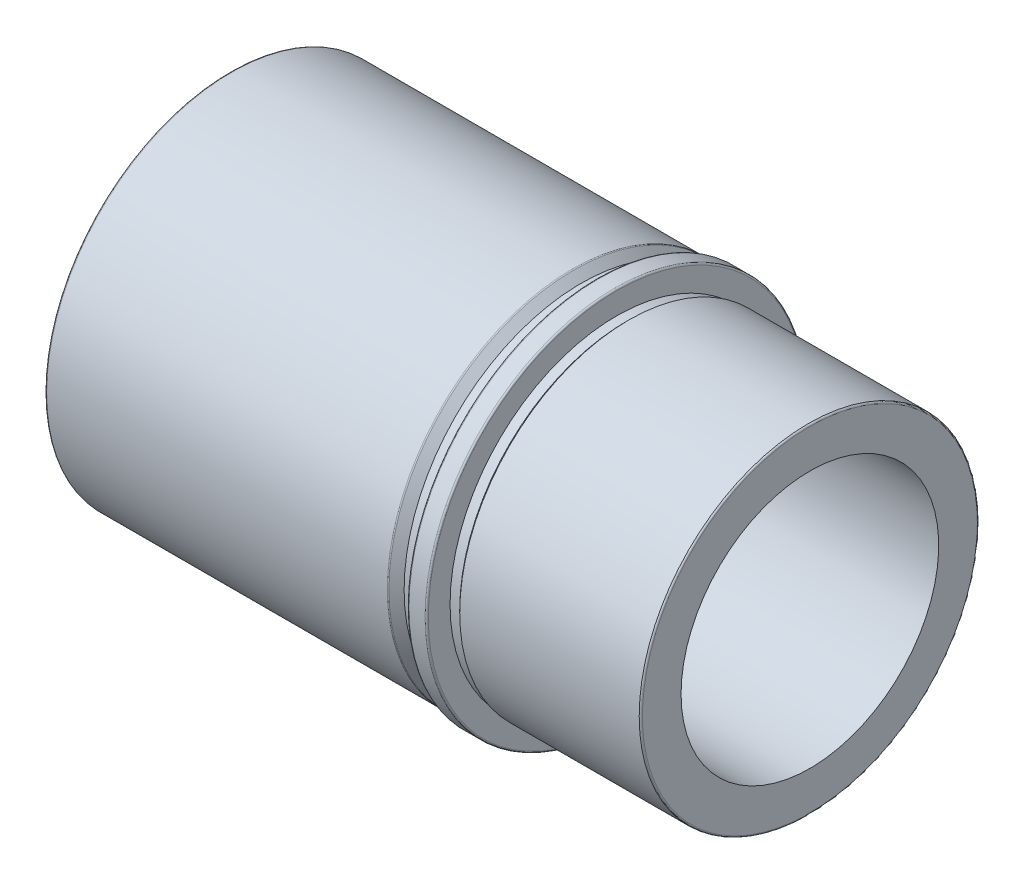
ISO-10303-21;
HEADER;
FILE_DESCRIPTION(('STEP AP214'),'2;1');
FILE_NAME('part.step','',(''),(''),'','','');
FILE_SCHEMA(('AUTOMOTIVE_DESIGN { 1 0 10303 214 1 1 1 1 }'));
ENDSEC;
DATA;
#1=APPLICATION_CONTEXT('core data for automotive mechanical design processes');
#2=APPLICATION_PROTOCOL_DEFINITION('international standard','automotive_design',2000,#1);
#3=PRODUCT_CONTEXT('',#1,'mechanical');
#4=PRODUCT('Part','Part','',(#3));
#5=PRODUCT_RELATED_PRODUCT_CATEGORY('part','',(#4));
#6=PRODUCT_DEFINITION_FORMATION('','',#4);
#7=PRODUCT_DEFINITION_CONTEXT('part definition',#1,'design');
#8=PRODUCT_DEFINITION('design','',#6,#7);
#9=PRODUCT_DEFINITION_SHAPE('','',#8);
#10=(LENGTH_UNIT() NAMED_UNIT(*) SI_UNIT(.MILLI.,.METRE.));
#11=(NAMED_UNIT(*) PLANE_ANGLE_UNIT() SI_UNIT($,.RADIAN.));
#12=(NAMED_UNIT(*) SI_UNIT($,.STERADIAN.) SOLID_ANGLE_UNIT());
#13=UNCERTAINTY_MEASURE_WITH_UNIT(LENGTH_MEASURE(1.E-05),#10,'distance_accuracy_value','');
#14=(GEOMETRIC_REPRESENTATION_CONTEXT(3) GLOBAL_UNCERTAINTY_ASSIGNED_CONTEXT((#13)) GLOBAL_UNIT_ASSIGNED_CONTEXT((#10,
#11,#12)) REPRESENTATION_CONTEXT('',''));
#15=CARTESIAN_POINT('',(0.,0.,0.));
#16=DIRECTION('',(0.,0.,1.));
#17=DIRECTION('',(1.,0.,0.));
#18=AXIS2_PLACEMENT_3D('',#15,#16,#17);
#19=CARTESIAN_POINT('',(-114.,-40.,0.));
#20=DIRECTION('',(-1.,0.,0.));
#21=DIRECTION('',(0.,0.,1.));
#22=AXIS2_PLACEMENT_3D('',#19,#20,#21);
#23=PLANE('',#22);
#24=CARTESIAN_POINT('',(-114.,0.,0.));
#25=DIRECTION('',(-1.,0.,0.));
#26=DIRECTION('',(0.,0.,1.));
#27=AXIS2_PLACEMENT_3D('',#24,#25,#26);
#28=CIRCLE('',#27,40.5);
#29=CARTESIAN_POINT('',(-114.,0.,40.5));
#30=VERTEX_POINT('',#29);
#31=EDGE_CURVE('E10',#30,#30,#28,.F.);
#32=ORIENTED_EDGE('',*,*,#31,.T.);
#33=EDGE_LOOP('',(#32));
#34=FACE_BOUND('',#33,.T.);
#35=CARTESIAN_POINT('',(-114.,0.,0.));
#36=DIRECTION('',(-1.,0.,0.));
#37=DIRECTION('',(0.,0.,1.));
#38=AXIS2_PLACEMENT_3D('',#35,#36,#37);
#39=CIRCLE('',#38,57.);
#40=CARTESIAN_POINT('',(-114.,0.,57.));
#41=VERTEX_POINT('',#40);
#42=EDGE_CURVE('E37',#41,#41,#39,.T.);
#43=ORIENTED_EDGE('',*,*,#42,.T.);
#44=EDGE_LOOP('',(#43));
#45=FACE_BOUND('',#44,.T.);
#46=ADVANCED_FACE('F30',(#34,#45),#23,.T.);
#47=CARTESIAN_POINT('',(-138.75822941746,0.,0.));
#48=DIRECTION('',(-1.,0.,0.));
#49=DIRECTION('',(0.,0.,1.));
#50=AXIS2_PLACEMENT_3D('',#47,#48,#49);
#51=CYLINDRICAL_SURFACE('',#50,57.5);
#52=CARTESIAN_POINT('',(-7.70710678118655,0.,0.));
#53=DIRECTION('',(1.,0.,0.));
#54=DIRECTION('',(0.,0.,-1.));
#55=AXIS2_PLACEMENT_3D('',#52,#53,#54);
#56=CIRCLE('',#55,57.5);
#57=CARTESIAN_POINT('',(-7.70710678118655,0.,-57.5));
#58=VERTEX_POINT('',#57);
#59=EDGE_CURVE('E50',#58,#58,#56,.F.);
#60=ORIENTED_EDGE('',*,*,#59,.T.);
#61=EDGE_LOOP('',(#60));
#62=FACE_BOUND('',#61,.T.);
#63=CARTESIAN_POINT('',(-113.5,0.,0.));
#64=DIRECTION('',(-1.,0.,0.));
#65=DIRECTION('',(0.,0.,1.));
#66=AXIS2_PLACEMENT_3D('',#63,#64,#65);
#67=CIRCLE('',#66,57.5);
#68=CARTESIAN_POINT('',(-113.5,0.,57.5));
#69=VERTEX_POINT('',#68);
#70=EDGE_CURVE('E53',#69,#69,#67,.F.);
#71=ORIENTED_EDGE('',*,*,#70,.T.);
#72=EDGE_LOOP('',(#71));
#73=FACE_BOUND('',#72,.T.);
#74=ADVANCED_FACE('F111',(#62,#73),#51,.T.);
#75=CARTESIAN_POINT('',(-7.50000000000001,0.,0.));
#76=DIRECTION('',(-1.,0.,0.));
#77=DIRECTION('',(0.,0.,1.));
#78=AXIS2_PLACEMENT_3D('',#75,#76,#77);
#79=CONICAL_SURFACE('',#78,57.5,0.78539816339745);
#80=CARTESIAN_POINT('',(-7.35355339059329,0.,0.));
#81=DIRECTION('',(1.,0.,0.));
#82=DIRECTION('',(0.,0.,-1.));
#83=AXIS2_PLACEMENT_3D('',#80,#81,#82);
#84=CIRCLE('',#83,57.3535533905933);
#85=CARTESIAN_POINT('',(-7.35355339059329,0.,-57.3535533905933));
#86=VERTEX_POINT('',#85);
#87=EDGE_CURVE('E45',#86,#86,#84,.T.);
#88=ORIENTED_EDGE('',*,*,#87,.T.);
#89=EDGE_LOOP('',(#88));
#90=FACE_BOUND('',#89,.T.);
#91=CARTESIAN_POINT('',(-5.,0.,0.));
#92=DIRECTION('',(-1.,0.,0.));
#93=DIRECTION('',(0.,0.,1.));
#94=AXIS2_PLACEMENT_3D('',#91,#92,#93);
#95=CIRCLE('',#94,55.);
#96=CARTESIAN_POINT('',(-5.,0.,55.));
#97=VERTEX_POINT('',#96);
#98=EDGE_CURVE('E74',#97,#97,#95,.T.);
#99=ORIENTED_EDGE('',*,*,#98,.T.);
#100=EDGE_LOOP('',(#99));
#101=FACE_BOUND('',#100,.T.);
#102=ADVANCED_FACE('F116',(#90,#101),#79,.T.);
#103=CARTESIAN_POINT('',(-138.75822941746,0.,0.));
#104=DIRECTION('',(-1.,0.,0.));
#105=DIRECTION('',(0.,0.,1.));
#106=AXIS2_PLACEMENT_3D('',#103,#104,#105);
#107=CYLINDRICAL_SURFACE('',#106,55.);
#108=CARTESIAN_POINT('',(0.,0.,0.));
#109=DIRECTION('',(-1.,0.,0.));
#110=DIRECTION('',(0.,0.,1.));
#111=AXIS2_PLACEMENT_3D('',#108,#109,#110);
#112=CIRCLE('',#111,55.);
#113=CARTESIAN_POINT('',(0.,0.,55.));
#114=VERTEX_POINT('',#113);
#115=EDGE_CURVE('E77',#114,#114,#112,.T.);
#116=ORIENTED_EDGE('',*,*,#115,.T.);
#117=EDGE_LOOP('',(#116));
#118=FACE_BOUND('',#117,.T.);
#119=ORIENTED_EDGE('',*,*,#98,.F.);
#120=EDGE_LOOP('',(#119));
#121=FACE_BOUND('',#120,.T.);
#122=ADVANCED_FACE('F228',(#118,#121),#107,.T.);
#123=CARTESIAN_POINT('',(0.,-55.,0.));
#124=DIRECTION('',(-1.,0.,0.));
#125=DIRECTION('',(0.,0.,1.));
#126=AXIS2_PLACEMENT_3D('',#123,#124,#125);
#127=PLANE('',#126);
#128=CARTESIAN_POINT('',(0.,0.,0.));
#129=DIRECTION('',(-1.,0.,0.));
#130=DIRECTION('',(0.,0.,1.));
#131=AXIS2_PLACEMENT_3D('',#128,#129,#130);
#132=CIRCLE('',#131,58.5);
#133=CARTESIAN_POINT('',(0.,0.,58.5));
#134=VERTEX_POINT('',#133);
#135=EDGE_CURVE('E56',#134,#134,#132,.T.);
#136=ORIENTED_EDGE('',*,*,#135,.T.);
#137=EDGE_LOOP('',(#136));
#138=FACE_BOUND('',#137,.T.);
#139=ORIENTED_EDGE('',*,*,#115,.F.);
#140=EDGE_LOOP('',(#139));
#141=FACE_BOUND('',#140,.T.);
#142=ADVANCED_FACE('F218',(#138,#141),#127,.T.);
#143=CARTESIAN_POINT('',(-138.75822941746,0.,0.));
#144=DIRECTION('',(-1.,0.,0.));
#145=DIRECTION('',(0.,0.,1.));
#146=AXIS2_PLACEMENT_3D('',#143,#144,#145);
#147=CYLINDRICAL_SURFACE('',#146,59.);
#148=CARTESIAN_POINT('',(5.50000000000001,0.,0.));
#149=DIRECTION('',(1.,0.,0.));
#150=DIRECTION('',(0.,0.,-1.));
#151=AXIS2_PLACEMENT_3D('',#148,#149,#150);
#152=CIRCLE('',#151,59.);
#153=CARTESIAN_POINT('',(5.50000000000001,0.,-59.));
#154=VERTEX_POINT('',#153);
#155=EDGE_CURVE('E62',#154,#154,#152,.F.);
#156=ORIENTED_EDGE('',*,*,#155,.T.);
#157=EDGE_LOOP('',(#156));
#158=FACE_BOUND('',#157,.T.);
#159=CARTESIAN_POINT('',(0.5,0.,0.));
#160=DIRECTION('',(-1.,0.,0.));
#161=DIRECTION('',(0.,0.,1.));
#162=AXIS2_PLACEMENT_3D('',#159,#160,#161);
#163=CIRCLE('',#162,59.);
#164=CARTESIAN_POINT('',(0.5,0.,59.));
#165=VERTEX_POINT('',#164);
#166=EDGE_CURVE('E65',#165,#165,#163,.F.);
#167=ORIENTED_EDGE('',*,*,#166,.T.);
#168=EDGE_LOOP('',(#167));
#169=FACE_BOUND('',#168,.T.);
#170=ADVANCED_FACE('F206',(#158,#169),#147,.T.);
#171=CARTESIAN_POINT('',(6.,-59.,0.));
#172=DIRECTION('',(1.,0.,0.));
#173=DIRECTION('',(0.,0.,-1.));
#174=AXIS2_PLACEMENT_3D('',#171,#172,#173);
#175=PLANE('',#174);
#176=CARTESIAN_POINT('',(6.,0.,0.));
#177=DIRECTION('',(1.,0.,0.));
#178=DIRECTION('',(0.,0.,-1.));
#179=AXIS2_PLACEMENT_3D('',#176,#177,#178);
#180=CIRCLE('',#179,58.5);
#181=CARTESIAN_POINT('',(6.,0.,-58.5));
#182=VERTEX_POINT('',#181);
#183=EDGE_CURVE('E59',#182,#182,#180,.T.);
#184=ORIENTED_EDGE('',*,*,#183,.T.);
#185=EDGE_LOOP('',(#184));
#186=FACE_BOUND('',#185,.T.);
#187=CARTESIAN_POINT('',(6.00000000000001,0.,0.));
#188=DIRECTION('',(-1.,0.,0.));
#189=DIRECTION('',(0.,0.,1.));
#190=AXIS2_PLACEMENT_3D('',#187,#188,#189);
#191=CIRCLE('',#190,51.7333656624692);
#192=CARTESIAN_POINT('',(6.00000000000001,0.,51.7333656624692));
#193=VERTEX_POINT('',#192);
#194=EDGE_CURVE('E80',#193,#193,#191,.T.);
#195=ORIENTED_EDGE('',*,*,#194,.T.);
#196=EDGE_LOOP('',(#195));
#197=FACE_BOUND('',#196,.T.);
#198=ADVANCED_FACE('F200',(#186,#197),#175,.T.);
#199=CARTESIAN_POINT('',(-138.75822941746,0.,0.));
#200=DIRECTION('',(-1.,0.,0.));
#201=DIRECTION('',(0.,0.,1.));
#202=AXIS2_PLACEMENT_3D('',#199,#200,#201);
#203=CYLINDRICAL_SURFACE('',#202,51.7333656624692);
#204=CARTESIAN_POINT('',(9.00000000000001,0.,0.));
#205=DIRECTION('',(-1.,0.,0.));
#206=DIRECTION('',(0.,0.,1.));
#207=AXIS2_PLACEMENT_3D('',#204,#205,#206);
#208=CIRCLE('',#207,51.7333656624692);
#209=CARTESIAN_POINT('',(9.00000000000001,0.,51.7333656624692));
#210=VERTEX_POINT('',#209);
#211=EDGE_CURVE('E83',#210,#210,#208,.T.);
#212=ORIENTED_EDGE('',*,*,#211,.T.);
#213=EDGE_LOOP('',(#212));
#214=FACE_BOUND('',#213,.T.);
#215=ORIENTED_EDGE('',*,*,#194,.F.);
#216=EDGE_LOOP('',(#215));
#217=FACE_BOUND('',#216,.T.);
#218=ADVANCED_FACE('F205',(#214,#217),#203,.T.);
#219=CARTESIAN_POINT('',(9.00000000000001,0.,0.));
#220=DIRECTION('',(1.,0.,0.));
#221=DIRECTION('',(0.,0.,-1.));
#222=AXIS2_PLACEMENT_3D('',#219,#220,#221);
#223=CONICAL_SURFACE('',#222,51.7333656624692,0.785398163397462);
#224=CARTESIAN_POINT('',(9.76663433753078,0.,0.));
#225=DIRECTION('',(-1.,0.,0.));
#226=DIRECTION('',(0.,0.,1.));
#227=AXIS2_PLACEMENT_3D('',#224,#225,#226);
#228=CIRCLE('',#227,52.5);
#229=CARTESIAN_POINT('',(9.76663433753078,0.,52.5));
#230=VERTEX_POINT('',#229);
#231=EDGE_CURVE('E86',#230,#230,#228,.T.);
#232=ORIENTED_EDGE('',*,*,#231,.T.);
#233=EDGE_LOOP('',(#232));
#234=FACE_BOUND('',#233,.T.);
#235=ORIENTED_EDGE('',*,*,#211,.F.);
#236=EDGE_LOOP('',(#235));
#237=FACE_BOUND('',#236,.T.);
#238=ADVANCED_FACE('F192',(#234,#237),#223,.T.);
#239=CARTESIAN_POINT('',(-138.75822941746,0.,0.));
#240=DIRECTION('',(-1.,0.,0.));
#241=DIRECTION('',(0.,0.,1.));
#242=AXIS2_PLACEMENT_3D('',#239,#240,#241);
#243=CYLINDRICAL_SURFACE('',#242,52.5);
#244=CARTESIAN_POINT('',(65.5,0.,0.));
#245=DIRECTION('',(1.,0.,0.));
#246=DIRECTION('',(0.,0.,-1.));
#247=AXIS2_PLACEMENT_3D('',#244,#245,#246);
#248=CIRCLE('',#247,52.5);
#249=CARTESIAN_POINT('',(65.5,0.,-52.5));
#250=VERTEX_POINT('',#249);
#251=EDGE_CURVE('E71',#250,#250,#248,.F.);
#252=ORIENTED_EDGE('',*,*,#251,.T.);
#253=EDGE_LOOP('',(#252));
#254=FACE_BOUND('',#253,.T.);
#255=ORIENTED_EDGE('',*,*,#231,.F.);
#256=EDGE_LOOP('',(#255));
#257=FACE_BOUND('',#256,.T.);
#258=ADVANCED_FACE('F107',(#254,#257),#243,.T.);
#259=CARTESIAN_POINT('',(66.,-52.5,0.));
#260=DIRECTION('',(1.,0.,0.));
#261=DIRECTION('',(0.,0.,-1.));
#262=AXIS2_PLACEMENT_3D('',#259,#260,#261);
#263=PLANE('',#262);
#264=CARTESIAN_POINT('',(66.,0.,0.));
#265=DIRECTION('',(1.,0.,0.));
#266=DIRECTION('',(0.,0.,-1.));
#267=AXIS2_PLACEMENT_3D('',#264,#265,#266);
#268=CIRCLE('',#267,52.);
#269=CARTESIAN_POINT('',(66.,0.,-52.));
#270=VERTEX_POINT('',#269);
#271=EDGE_CURVE('E68',#270,#270,#268,.T.);
#272=ORIENTED_EDGE('',*,*,#271,.T.);
#273=EDGE_LOOP('',(#272));
#274=FACE_BOUND('',#273,.T.);
#275=CARTESIAN_POINT('',(66.,0.,0.));
#276=DIRECTION('',(-1.,0.,0.));
#277=DIRECTION('',(0.,0.,1.));
#278=AXIS2_PLACEMENT_3D('',#275,#276,#277);
#279=CIRCLE('',#278,40.);
#280=CARTESIAN_POINT('',(66.,0.,40.));
#281=VERTEX_POINT('',#280);
#282=EDGE_CURVE('E89',#281,#281,#279,.T.);
#283=ORIENTED_EDGE('',*,*,#282,.T.);
#284=EDGE_LOOP('',(#283));
#285=FACE_BOUND('',#284,.T.);
#286=ADVANCED_FACE('F93',(#274,#285),#263,.T.);
#287=CARTESIAN_POINT('',(-138.75822941746,0.,0.));
#288=DIRECTION('',(-1.,0.,0.));
#289=DIRECTION('',(0.,0.,1.));
#290=AXIS2_PLACEMENT_3D('',#287,#288,#289);
#291=CYLINDRICAL_SURFACE('',#290,40.);
#292=CARTESIAN_POINT('',(-113.5,0.,0.));
#293=DIRECTION('',(-1.,0.,0.));
#294=DIRECTION('',(0.,0.,1.));
#295=AXIS2_PLACEMENT_3D('',#292,#293,#294);
#296=CIRCLE('',#295,40.);
#297=CARTESIAN_POINT('',(-113.5,0.,40.));
#298=VERTEX_POINT('',#297);
#299=EDGE_CURVE('E41',#298,#298,#296,.T.);
#300=ORIENTED_EDGE('',*,*,#299,.T.);
#301=EDGE_LOOP('',(#300));
#302=FACE_BOUND('',#301,.T.);
#303=ORIENTED_EDGE('',*,*,#282,.F.);
#304=EDGE_LOOP('',(#303));
#305=FACE_BOUND('',#304,.T.);
#306=ADVANCED_FACE('F95',(#302,#305),#291,.F.);
#307=CARTESIAN_POINT('',(65.5,0.,0.));
#308=DIRECTION('',(1.,0.,0.));
#309=DIRECTION('',(0.,0.,-1.));
#310=AXIS2_PLACEMENT_3D('',#307,#308,#309);
#311=TOROIDAL_SURFACE('',#310,52.,0.5);
#312=ORIENTED_EDGE('',*,*,#271,.F.);
#313=EDGE_LOOP('',(#312));
#314=FACE_BOUND('',#313,.T.);
#315=ORIENTED_EDGE('',*,*,#251,.F.);
#316=EDGE_LOOP('',(#315));
#317=FACE_BOUND('',#316,.T.);
#318=ADVANCED_FACE('F97',(#314,#317),#311,.T.);
#319=CARTESIAN_POINT('',(5.50000000000001,0.,0.));
#320=DIRECTION('',(1.,0.,0.));
#321=DIRECTION('',(0.,0.,-1.));
#322=AXIS2_PLACEMENT_3D('',#319,#320,#321);
#323=TOROIDAL_SURFACE('',#322,58.5,0.5);
#324=ORIENTED_EDGE('',*,*,#183,.F.);
#325=EDGE_LOOP('',(#324));
#326=FACE_BOUND('',#325,.T.);
#327=ORIENTED_EDGE('',*,*,#155,.F.);
#328=EDGE_LOOP('',(#327));
#329=FACE_BOUND('',#328,.T.);
#330=ADVANCED_FACE('F104',(#326,#329),#323,.T.);
#331=CARTESIAN_POINT('',(0.5,0.,0.));
#332=DIRECTION('',(-1.,0.,0.));
#333=DIRECTION('',(0.,0.,1.));
#334=AXIS2_PLACEMENT_3D('',#331,#332,#333);
#335=TOROIDAL_SURFACE('',#334,58.5,0.5);
#336=ORIENTED_EDGE('',*,*,#166,.F.);
#337=EDGE_LOOP('',(#336));
#338=FACE_BOUND('',#337,.T.);
#339=ORIENTED_EDGE('',*,*,#135,.F.);
#340=EDGE_LOOP('',(#339));
#341=FACE_BOUND('',#340,.T.);
#342=ADVANCED_FACE('F123',(#338,#341),#335,.T.);
#343=CARTESIAN_POINT('',(-7.70710678118655,0.,0.));
#344=DIRECTION('',(1.,0.,0.));
#345=DIRECTION('',(0.,0.,-1.));
#346=AXIS2_PLACEMENT_3D('',#343,#344,#345);
#347=TOROIDAL_SURFACE('',#346,57.,0.5);
#348=ORIENTED_EDGE('',*,*,#87,.F.);
#349=EDGE_LOOP('',(#348));
#350=FACE_BOUND('',#349,.T.);
#351=ORIENTED_EDGE('',*,*,#59,.F.);
#352=EDGE_LOOP('',(#351));
#353=FACE_BOUND('',#352,.T.);
#354=ADVANCED_FACE('F127',(#350,#353),#347,.T.);
#355=CARTESIAN_POINT('',(-113.5,0.,0.));
#356=DIRECTION('',(-1.,0.,0.));
#357=DIRECTION('',(0.,0.,1.));
#358=AXIS2_PLACEMENT_3D('',#355,#356,#357);
#359=TOROIDAL_SURFACE('',#358,40.5,0.5);
#360=ORIENTED_EDGE('',*,*,#31,.F.);
#361=EDGE_LOOP('',(#360));
#362=FACE_BOUND('',#361,.T.);
#363=ORIENTED_EDGE('',*,*,#299,.F.);
#364=EDGE_LOOP('',(#363));
#365=FACE_BOUND('',#364,.T.);
#366=ADVANCED_FACE('F130',(#362,#365),#359,.T.);
#367=CARTESIAN_POINT('',(-113.5,0.,0.));
#368=DIRECTION('',(-1.,0.,0.));
#369=DIRECTION('',(0.,0.,1.));
#370=AXIS2_PLACEMENT_3D('',#367,#368,#369);
#371=TOROIDAL_SURFACE('',#370,57.,0.5);
#372=ORIENTED_EDGE('',*,*,#70,.F.);
#373=EDGE_LOOP('',(#372));
#374=FACE_BOUND('',#373,.T.);
#375=ORIENTED_EDGE('',*,*,#42,.F.);
#376=EDGE_LOOP('',(#375));
#377=FACE_BOUND('',#376,.T.);
#378=ADVANCED_FACE('F32',(#374,#377),#371,.T.);
#379=CLOSED_SHELL('',(#46,#74,#102,#122,#142,#170,#198,#218,#238,#258,#286,#306,#318,#330,#342,
#354,#366,#378));
#380=MANIFOLD_SOLID_BREP('B2',#379);
#381=ADVANCED_BREP_SHAPE_REPRESENTATION('',(#18,#380),#14);
#382=SHAPE_DEFINITION_REPRESENTATION(#9,#381);
ENDSEC;
END-ISO-10303-21;
